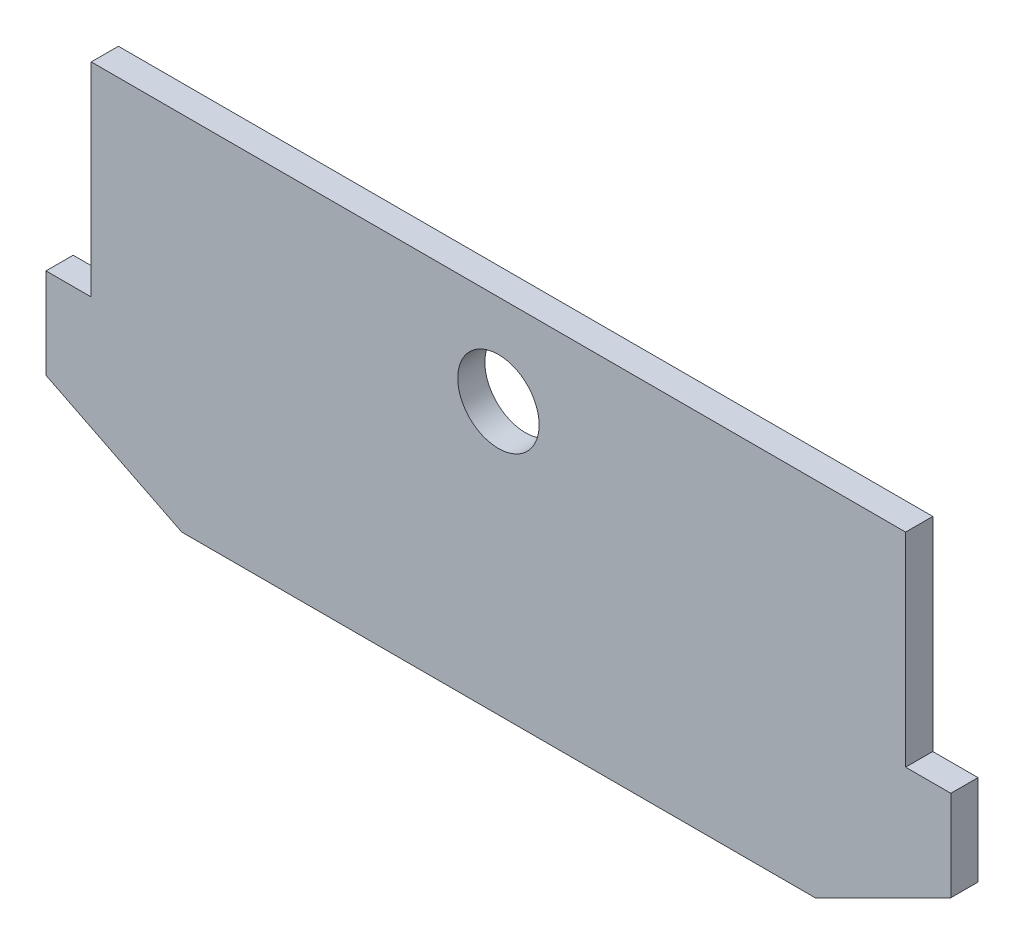
ISO-10303-21;
HEADER;
FILE_DESCRIPTION(('STEP AP214'),'2;1');
FILE_NAME('part.step','',(''),(''),'','','');
FILE_SCHEMA(('AUTOMOTIVE_DESIGN { 1 0 10303 214 1 1 1 1 }'));
ENDSEC;
DATA;
#1=APPLICATION_CONTEXT('core data for automotive mechanical design processes');
#2=APPLICATION_PROTOCOL_DEFINITION('international standard','automotive_design',2000,#1);
#3=PRODUCT_CONTEXT('',#1,'mechanical');
#4=PRODUCT('Part','Part','',(#3));
#5=PRODUCT_RELATED_PRODUCT_CATEGORY('part','',(#4));
#6=PRODUCT_DEFINITION_FORMATION('','',#4);
#7=PRODUCT_DEFINITION_CONTEXT('part definition',#1,'design');
#8=PRODUCT_DEFINITION('design','',#6,#7);
#9=PRODUCT_DEFINITION_SHAPE('','',#8);
#10=(LENGTH_UNIT() NAMED_UNIT(*) SI_UNIT(.MILLI.,.METRE.));
#11=(NAMED_UNIT(*) PLANE_ANGLE_UNIT() SI_UNIT($,.RADIAN.));
#12=(NAMED_UNIT(*) SI_UNIT($,.STERADIAN.) SOLID_ANGLE_UNIT());
#13=UNCERTAINTY_MEASURE_WITH_UNIT(LENGTH_MEASURE(1.E-05),#10,'distance_accuracy_value','');
#14=(GEOMETRIC_REPRESENTATION_CONTEXT(3) GLOBAL_UNCERTAINTY_ASSIGNED_CONTEXT((#13)) GLOBAL_UNIT_ASSIGNED_CONTEXT((#10,
#11,#12)) REPRESENTATION_CONTEXT('',''));
#15=CARTESIAN_POINT('',(0.,0.,0.));
#16=DIRECTION('',(0.,0.,1.));
#17=DIRECTION('',(1.,0.,0.));
#18=AXIS2_PLACEMENT_3D('',#15,#16,#17);
#19=CARTESIAN_POINT('',(-90.,20.,-3.));
#20=DIRECTION('',(-1.,0.,0.));
#21=DIRECTION('',(0.,0.,1.));
#22=AXIS2_PLACEMENT_3D('',#19,#20,#21);
#23=PLANE('',#22);
#24=DIRECTION('',(0.,0.,1.));
#25=VECTOR('',#24,1.);
#26=CARTESIAN_POINT('',(-90.,-25.,-3.));
#27=LINE('',#26,#25);
#28=CARTESIAN_POINT('',(-90.,-25.,-3.));
#29=VERTEX_POINT('',#28);
#30=CARTESIAN_POINT('',(-90.,-25.,3.));
#31=VERTEX_POINT('',#30);
#32=EDGE_CURVE('E36',#29,#31,#27,.T.);
#33=ORIENTED_EDGE('',*,*,#32,.T.);
#34=DIRECTION('',(0.,-1.,0.));
#35=VECTOR('',#34,1.);
#36=CARTESIAN_POINT('',(-90.,20.,3.));
#37=LINE('',#36,#35);
#38=CARTESIAN_POINT('',(-90.,20.,3.));
#39=VERTEX_POINT('',#38);
#40=EDGE_CURVE('E109',#39,#31,#37,.T.);
#41=ORIENTED_EDGE('',*,*,#40,.F.);
#42=DIRECTION('',(0.,0.,1.));
#43=VECTOR('',#42,1.);
#44=CARTESIAN_POINT('',(-90.,20.,-3.));
#45=LINE('',#44,#43);
#46=CARTESIAN_POINT('',(-90.,20.,-3.));
#47=VERTEX_POINT('',#46);
#48=EDGE_CURVE('E11',#47,#39,#45,.T.);
#49=ORIENTED_EDGE('',*,*,#48,.F.);
#50=DIRECTION('',(0.,-1.,0.));
#51=VECTOR('',#50,1.);
#52=CARTESIAN_POINT('',(-90.,20.,-3.));
#53=LINE('',#52,#51);
#54=EDGE_CURVE('E110',#47,#29,#53,.T.);
#55=ORIENTED_EDGE('',*,*,#54,.T.);
#56=EDGE_LOOP('',(#33,#41,#49,#55));
#57=FACE_BOUND('',#56,.T.);
#58=ADVANCED_FACE('F33',(#57),#23,.T.);
#59=CARTESIAN_POINT('',(-90.,20.,-3.));
#60=DIRECTION('',(0.,1.,0.));
#61=DIRECTION('',(-1.,0.,0.));
#62=AXIS2_PLACEMENT_3D('',#59,#60,#61);
#63=PLANE('',#62);
#64=ORIENTED_EDGE('',*,*,#48,.T.);
#65=DIRECTION('',(-1.,0.,0.));
#66=VECTOR('',#65,1.);
#67=CARTESIAN_POINT('',(-90.,20.,3.));
#68=LINE('',#67,#66);
#69=CARTESIAN_POINT('',(90.,20.,3.));
#70=VERTEX_POINT('',#69);
#71=EDGE_CURVE('E128',#70,#39,#68,.T.);
#72=ORIENTED_EDGE('',*,*,#71,.F.);
#73=DIRECTION('',(0.,0.,1.));
#74=VECTOR('',#73,1.);
#75=CARTESIAN_POINT('',(90.,20.,-3.));
#76=LINE('',#75,#74);
#77=CARTESIAN_POINT('',(90.,20.,-3.));
#78=VERTEX_POINT('',#77);
#79=EDGE_CURVE('E41',#78,#70,#76,.T.);
#80=ORIENTED_EDGE('',*,*,#79,.F.);
#81=DIRECTION('',(-1.,0.,0.));
#82=VECTOR('',#81,1.);
#83=CARTESIAN_POINT('',(-90.,20.,-3.));
#84=LINE('',#83,#82);
#85=EDGE_CURVE('E115',#78,#47,#84,.T.);
#86=ORIENTED_EDGE('',*,*,#85,.T.);
#87=EDGE_LOOP('',(#64,#72,#80,#86));
#88=FACE_BOUND('',#87,.T.);
#89=ADVANCED_FACE('F222',(#88),#63,.T.);
#90=CARTESIAN_POINT('',(90.,20.,-3.));
#91=DIRECTION('',(1.,0.,0.));
#92=DIRECTION('',(0.,0.,-1.));
#93=AXIS2_PLACEMENT_3D('',#90,#91,#92);
#94=PLANE('',#93);
#95=ORIENTED_EDGE('',*,*,#79,.T.);
#96=DIRECTION('',(0.,1.,0.));
#97=VECTOR('',#96,1.);
#98=CARTESIAN_POINT('',(90.,20.,3.));
#99=LINE('',#98,#97);
#100=CARTESIAN_POINT('',(90.,-25.,3.));
#101=VERTEX_POINT('',#100);
#102=EDGE_CURVE('E150',#101,#70,#99,.T.);
#103=ORIENTED_EDGE('',*,*,#102,.F.);
#104=DIRECTION('',(0.,0.,1.));
#105=VECTOR('',#104,1.);
#106=CARTESIAN_POINT('',(90.,-25.,-3.));
#107=LINE('',#106,#105);
#108=CARTESIAN_POINT('',(90.,-25.,-3.));
#109=VERTEX_POINT('',#108);
#110=EDGE_CURVE('E181',#109,#101,#107,.T.);
#111=ORIENTED_EDGE('',*,*,#110,.F.);
#112=DIRECTION('',(0.,1.,0.));
#113=VECTOR('',#112,1.);
#114=CARTESIAN_POINT('',(90.,20.,-3.));
#115=LINE('',#114,#113);
#116=EDGE_CURVE('E177',#109,#78,#115,.T.);
#117=ORIENTED_EDGE('',*,*,#116,.T.);
#118=EDGE_LOOP('',(#95,#103,#111,#117));
#119=FACE_BOUND('',#118,.T.);
#120=ADVANCED_FACE('F220',(#119),#94,.T.);
#121=CARTESIAN_POINT('',(100.,-25.,-3.));
#122=DIRECTION('',(0.,1.,0.));
#123=DIRECTION('',(0.,0.,1.));
#124=AXIS2_PLACEMENT_3D('',#121,#122,#123);
#125=PLANE('',#124);
#126=ORIENTED_EDGE('',*,*,#110,.T.);
#127=DIRECTION('',(-1.,0.,0.));
#128=VECTOR('',#127,1.);
#129=CARTESIAN_POINT('',(100.,-25.,3.));
#130=LINE('',#129,#128);
#131=CARTESIAN_POINT('',(100.,-25.,3.));
#132=VERTEX_POINT('',#131);
#133=EDGE_CURVE('E147',#132,#101,#130,.T.);
#134=ORIENTED_EDGE('',*,*,#133,.F.);
#135=DIRECTION('',(0.,0.,1.));
#136=VECTOR('',#135,1.);
#137=CARTESIAN_POINT('',(100.,-25.,-3.));
#138=LINE('',#137,#136);
#139=CARTESIAN_POINT('',(100.,-25.,-3.));
#140=VERTEX_POINT('',#139);
#141=EDGE_CURVE('E183',#140,#132,#138,.T.);
#142=ORIENTED_EDGE('',*,*,#141,.F.);
#143=DIRECTION('',(-1.,0.,0.));
#144=VECTOR('',#143,1.);
#145=CARTESIAN_POINT('',(100.,-25.,-3.));
#146=LINE('',#145,#144);
#147=EDGE_CURVE('E174',#140,#109,#146,.T.);
#148=ORIENTED_EDGE('',*,*,#147,.T.);
#149=EDGE_LOOP('',(#126,#134,#142,#148));
#150=FACE_BOUND('',#149,.T.);
#151=ADVANCED_FACE('F216',(#150),#125,.T.);
#152=CARTESIAN_POINT('',(100.,-45.,-3.));
#153=DIRECTION('',(1.,0.,0.));
#154=DIRECTION('',(0.,1.,0.));
#155=AXIS2_PLACEMENT_3D('',#152,#153,#154);
#156=PLANE('',#155);
#157=ORIENTED_EDGE('',*,*,#141,.T.);
#158=DIRECTION('',(0.,1.,0.));
#159=VECTOR('',#158,1.);
#160=CARTESIAN_POINT('',(100.,-45.,3.));
#161=LINE('',#160,#159);
#162=CARTESIAN_POINT('',(100.,-45.,3.));
#163=VERTEX_POINT('',#162);
#164=EDGE_CURVE('E144',#163,#132,#161,.T.);
#165=ORIENTED_EDGE('',*,*,#164,.F.);
#166=DIRECTION('',(0.,0.,1.));
#167=VECTOR('',#166,1.);
#168=CARTESIAN_POINT('',(100.,-45.,-3.));
#169=LINE('',#168,#167);
#170=CARTESIAN_POINT('',(100.,-45.,-3.));
#171=VERTEX_POINT('',#170);
#172=EDGE_CURVE('E185',#171,#163,#169,.T.);
#173=ORIENTED_EDGE('',*,*,#172,.F.);
#174=DIRECTION('',(0.,1.,0.));
#175=VECTOR('',#174,1.);
#176=CARTESIAN_POINT('',(100.,-45.,-3.));
#177=LINE('',#176,#175);
#178=EDGE_CURVE('E171',#171,#140,#177,.T.);
#179=ORIENTED_EDGE('',*,*,#178,.T.);
#180=EDGE_LOOP('',(#157,#165,#173,#179));
#181=FACE_BOUND('',#180,.T.);
#182=ADVANCED_FACE('F214',(#181),#156,.T.);
#183=CARTESIAN_POINT('',(70.,-60.,-3.));
#184=DIRECTION('',(0.447213595499958,-0.894427190999916,0.));
#185=DIRECTION('',(0.894427190999916,0.447213595499958,0.));
#186=AXIS2_PLACEMENT_3D('',#183,#184,#185);
#187=PLANE('',#186);
#188=ORIENTED_EDGE('',*,*,#172,.T.);
#189=DIRECTION('',(0.894427190999916,0.447213595499958,0.));
#190=VECTOR('',#189,1.);
#191=CARTESIAN_POINT('',(70.,-60.,3.));
#192=LINE('',#191,#190);
#193=CARTESIAN_POINT('',(70.,-60.,3.));
#194=VERTEX_POINT('',#193);
#195=EDGE_CURVE('E141',#194,#163,#192,.T.);
#196=ORIENTED_EDGE('',*,*,#195,.F.);
#197=DIRECTION('',(0.,0.,1.));
#198=VECTOR('',#197,1.);
#199=CARTESIAN_POINT('',(70.,-60.,-3.));
#200=LINE('',#199,#198);
#201=CARTESIAN_POINT('',(70.,-60.,-3.));
#202=VERTEX_POINT('',#201);
#203=EDGE_CURVE('E187',#202,#194,#200,.T.);
#204=ORIENTED_EDGE('',*,*,#203,.F.);
#205=DIRECTION('',(0.894427190999916,0.447213595499958,0.));
#206=VECTOR('',#205,1.);
#207=CARTESIAN_POINT('',(70.,-60.,-3.));
#208=LINE('',#207,#206);
#209=EDGE_CURVE('E168',#202,#171,#208,.T.);
#210=ORIENTED_EDGE('',*,*,#209,.T.);
#211=EDGE_LOOP('',(#188,#196,#204,#210));
#212=FACE_BOUND('',#211,.T.);
#213=ADVANCED_FACE('F209',(#212),#187,.T.);
#214=CARTESIAN_POINT('',(-70.,-60.,-3.));
#215=DIRECTION('',(0.,-1.,0.));
#216=DIRECTION('',(1.,0.,0.));
#217=AXIS2_PLACEMENT_3D('',#214,#215,#216);
#218=PLANE('',#217);
#219=ORIENTED_EDGE('',*,*,#203,.T.);
#220=DIRECTION('',(1.,0.,0.));
#221=VECTOR('',#220,1.);
#222=CARTESIAN_POINT('',(-70.,-60.,3.));
#223=LINE('',#222,#221);
#224=CARTESIAN_POINT('',(-70.,-60.,3.));
#225=VERTEX_POINT('',#224);
#226=EDGE_CURVE('E138',#225,#194,#223,.T.);
#227=ORIENTED_EDGE('',*,*,#226,.F.);
#228=DIRECTION('',(0.,0.,1.));
#229=VECTOR('',#228,1.);
#230=CARTESIAN_POINT('',(-70.,-60.,-3.));
#231=LINE('',#230,#229);
#232=CARTESIAN_POINT('',(-70.,-60.,-3.));
#233=VERTEX_POINT('',#232);
#234=EDGE_CURVE('E189',#233,#225,#231,.T.);
#235=ORIENTED_EDGE('',*,*,#234,.F.);
#236=DIRECTION('',(1.,0.,0.));
#237=VECTOR('',#236,1.);
#238=CARTESIAN_POINT('',(-70.,-60.,-3.));
#239=LINE('',#238,#237);
#240=EDGE_CURVE('E165',#233,#202,#239,.T.);
#241=ORIENTED_EDGE('',*,*,#240,.T.);
#242=EDGE_LOOP('',(#219,#227,#235,#241));
#243=FACE_BOUND('',#242,.T.);
#244=ADVANCED_FACE('F202',(#243),#218,.T.);
#245=CARTESIAN_POINT('',(-70.,-60.,-3.));
#246=DIRECTION('',(-0.447213595499958,-0.894427190999916,0.));
#247=DIRECTION('',(0.894427190999916,-0.447213595499958,0.));
#248=AXIS2_PLACEMENT_3D('',#245,#246,#247);
#249=PLANE('',#248);
#250=ORIENTED_EDGE('',*,*,#234,.T.);
#251=DIRECTION('',(0.894427190999916,-0.447213595499958,0.));
#252=VECTOR('',#251,1.);
#253=CARTESIAN_POINT('',(-70.,-60.,3.));
#254=LINE('',#253,#252);
#255=CARTESIAN_POINT('',(-99.9999999999999,-45.,3.));
#256=VERTEX_POINT('',#255);
#257=EDGE_CURVE('E135',#256,#225,#254,.T.);
#258=ORIENTED_EDGE('',*,*,#257,.F.);
#259=DIRECTION('',(0.,0.,1.));
#260=VECTOR('',#259,1.);
#261=CARTESIAN_POINT('',(-99.9999999999999,-45.,-3.));
#262=LINE('',#261,#260);
#263=CARTESIAN_POINT('',(-99.9999999999999,-45.,-3.));
#264=VERTEX_POINT('',#263);
#265=EDGE_CURVE('E191',#264,#256,#262,.T.);
#266=ORIENTED_EDGE('',*,*,#265,.F.);
#267=DIRECTION('',(0.894427190999916,-0.447213595499958,0.));
#268=VECTOR('',#267,1.);
#269=CARTESIAN_POINT('',(-70.,-60.,-3.));
#270=LINE('',#269,#268);
#271=EDGE_CURVE('E162',#264,#233,#270,.T.);
#272=ORIENTED_EDGE('',*,*,#271,.T.);
#273=EDGE_LOOP('',(#250,#258,#266,#272));
#274=FACE_BOUND('',#273,.T.);
#275=ADVANCED_FACE('F199',(#274),#249,.T.);
#276=CARTESIAN_POINT('',(-99.9999999999999,-45.,-3.));
#277=DIRECTION('',(-1.,0.,0.));
#278=DIRECTION('',(0.,-1.,0.));
#279=AXIS2_PLACEMENT_3D('',#276,#277,#278);
#280=PLANE('',#279);
#281=ORIENTED_EDGE('',*,*,#265,.T.);
#282=DIRECTION('',(0.,-1.,0.));
#283=VECTOR('',#282,1.);
#284=CARTESIAN_POINT('',(-99.9999999999999,-45.,3.));
#285=LINE('',#284,#283);
#286=CARTESIAN_POINT('',(-100.,-25.,3.));
#287=VERTEX_POINT('',#286);
#288=EDGE_CURVE('E122',#287,#256,#285,.T.);
#289=ORIENTED_EDGE('',*,*,#288,.F.);
#290=DIRECTION('',(0.,0.,1.));
#291=VECTOR('',#290,1.);
#292=CARTESIAN_POINT('',(-100.,-25.,-3.));
#293=LINE('',#292,#291);
#294=CARTESIAN_POINT('',(-100.,-25.,-3.));
#295=VERTEX_POINT('',#294);
#296=EDGE_CURVE('E114',#295,#287,#293,.T.);
#297=ORIENTED_EDGE('',*,*,#296,.F.);
#298=DIRECTION('',(0.,-1.,0.));
#299=VECTOR('',#298,1.);
#300=CARTESIAN_POINT('',(-99.9999999999999,-45.,-3.));
#301=LINE('',#300,#299);
#302=EDGE_CURVE('E159',#295,#264,#301,.T.);
#303=ORIENTED_EDGE('',*,*,#302,.T.);
#304=EDGE_LOOP('',(#281,#289,#297,#303));
#305=FACE_BOUND('',#304,.T.);
#306=ADVANCED_FACE('F193',(#305),#280,.T.);
#307=CARTESIAN_POINT('',(-100.,-25.,-3.));
#308=DIRECTION('',(0.,1.,0.));
#309=DIRECTION('',(-1.,0.,0.));
#310=AXIS2_PLACEMENT_3D('',#307,#308,#309);
#311=PLANE('',#310);
#312=ORIENTED_EDGE('',*,*,#296,.T.);
#313=DIRECTION('',(-1.,0.,0.));
#314=VECTOR('',#313,1.);
#315=CARTESIAN_POINT('',(-100.,-25.,3.));
#316=LINE('',#315,#314);
#317=EDGE_CURVE('E117',#31,#287,#316,.T.);
#318=ORIENTED_EDGE('',*,*,#317,.F.);
#319=ORIENTED_EDGE('',*,*,#32,.F.);
#320=DIRECTION('',(-1.,0.,0.));
#321=VECTOR('',#320,1.);
#322=CARTESIAN_POINT('',(-100.,-25.,-3.));
#323=LINE('',#322,#321);
#324=EDGE_CURVE('E157',#29,#295,#323,.T.);
#325=ORIENTED_EDGE('',*,*,#324,.T.);
#326=EDGE_LOOP('',(#312,#318,#319,#325));
#327=FACE_BOUND('',#326,.T.);
#328=ADVANCED_FACE('F118',(#327),#311,.T.);
#329=CARTESIAN_POINT('',(0.,0.,-3.));
#330=DIRECTION('',(0.,0.,1.));
#331=DIRECTION('',(1.,0.,0.));
#332=AXIS2_PLACEMENT_3D('',#329,#330,#331);
#333=PLANE('',#332);
#334=CARTESIAN_POINT('',(0.,0.,-3.));
#335=DIRECTION('',(0.,0.,1.));
#336=DIRECTION('',(1.,0.,0.));
#337=AXIS2_PLACEMENT_3D('',#334,#335,#336);
#338=CIRCLE('',#337,9.);
#339=CARTESIAN_POINT('',(9.,0.,-3.));
#340=VERTEX_POINT('',#339);
#341=EDGE_CURVE('E153',#340,#340,#338,.T.);
#342=ORIENTED_EDGE('',*,*,#341,.T.);
#343=EDGE_LOOP('',(#342));
#344=FACE_BOUND('',#343,.T.);
#345=ORIENTED_EDGE('',*,*,#54,.F.);
#346=ORIENTED_EDGE('',*,*,#85,.F.);
#347=ORIENTED_EDGE('',*,*,#116,.F.);
#348=ORIENTED_EDGE('',*,*,#147,.F.);
#349=ORIENTED_EDGE('',*,*,#178,.F.);
#350=ORIENTED_EDGE('',*,*,#209,.F.);
#351=ORIENTED_EDGE('',*,*,#240,.F.);
#352=ORIENTED_EDGE('',*,*,#271,.F.);
#353=ORIENTED_EDGE('',*,*,#302,.F.);
#354=ORIENTED_EDGE('',*,*,#324,.F.);
#355=EDGE_LOOP('',(#345,#346,#347,#348,#349,#350,#351,#352,#353,#354));
#356=FACE_BOUND('',#355,.T.);
#357=ADVANCED_FACE('F205',(#344,#356),#333,.F.);
#358=CARTESIAN_POINT('',(0.,0.,-3.));
#359=DIRECTION('',(0.,0.,1.));
#360=DIRECTION('',(1.,0.,0.));
#361=AXIS2_PLACEMENT_3D('',#358,#359,#360);
#362=CYLINDRICAL_SURFACE('',#361,9.);
#363=ORIENTED_EDGE('',*,*,#341,.F.);
#364=EDGE_LOOP('',(#363));
#365=FACE_BOUND('',#364,.T.);
#366=CARTESIAN_POINT('',(0.,0.,3.));
#367=DIRECTION('',(0.,0.,1.));
#368=DIRECTION('',(1.,0.,0.));
#369=AXIS2_PLACEMENT_3D('',#366,#367,#368);
#370=CIRCLE('',#369,9.);
#371=CARTESIAN_POINT('',(9.,0.,3.));
#372=VERTEX_POINT('',#371);
#373=EDGE_CURVE('E129',#372,#372,#370,.T.);
#374=ORIENTED_EDGE('',*,*,#373,.T.);
#375=EDGE_LOOP('',(#374));
#376=FACE_BOUND('',#375,.T.);
#377=ADVANCED_FACE('F248',(#365,#376),#362,.F.);
#378=CARTESIAN_POINT('',(0.,0.,3.));
#379=DIRECTION('',(0.,0.,1.));
#380=DIRECTION('',(1.,0.,0.));
#381=AXIS2_PLACEMENT_3D('',#378,#379,#380);
#382=PLANE('',#381);
#383=ORIENTED_EDGE('',*,*,#40,.T.);
#384=ORIENTED_EDGE('',*,*,#317,.T.);
#385=ORIENTED_EDGE('',*,*,#288,.T.);
#386=ORIENTED_EDGE('',*,*,#257,.T.);
#387=ORIENTED_EDGE('',*,*,#226,.T.);
#388=ORIENTED_EDGE('',*,*,#195,.T.);
#389=ORIENTED_EDGE('',*,*,#164,.T.);
#390=ORIENTED_EDGE('',*,*,#133,.T.);
#391=ORIENTED_EDGE('',*,*,#102,.T.);
#392=ORIENTED_EDGE('',*,*,#71,.T.);
#393=EDGE_LOOP('',(#383,#384,#385,#386,#387,#388,#389,#390,#391,#392));
#394=FACE_BOUND('',#393,.T.);
#395=ORIENTED_EDGE('',*,*,#373,.F.);
#396=EDGE_LOOP('',(#395));
#397=FACE_BOUND('',#396,.T.);
#398=ADVANCED_FACE('F125',(#394,#397),#382,.T.);
#399=CLOSED_SHELL('',(#58,#89,#120,#151,#182,#213,#244,#275,#306,#328,#357,#377,#398));
#400=MANIFOLD_SOLID_BREP('B2',#399);
#401=ADVANCED_BREP_SHAPE_REPRESENTATION('',(#18,#400),#14);
#402=SHAPE_DEFINITION_REPRESENTATION(#9,#401);
ENDSEC;
END-ISO-10303-21;
